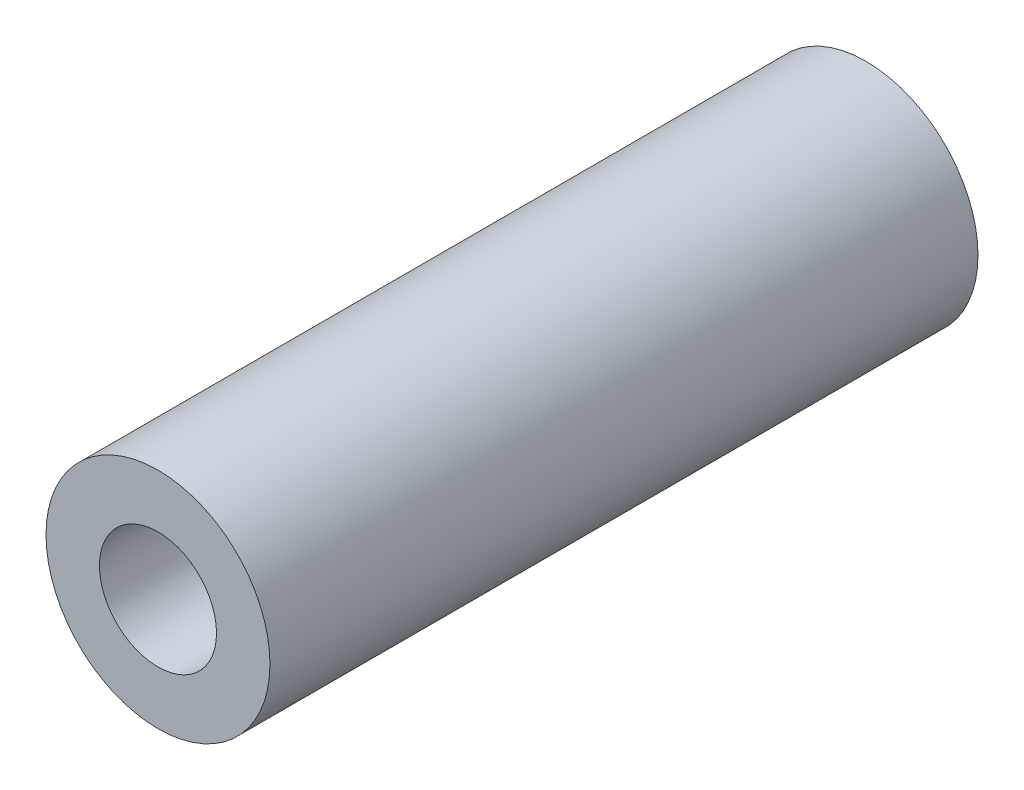
ISO-10303-21;
HEADER;
FILE_DESCRIPTION(('STEP AP214'),'2;1');
FILE_NAME('part.step','',(''),(''),'','','');
FILE_SCHEMA(('AUTOMOTIVE_DESIGN { 1 0 10303 214 1 1 1 1 }'));
ENDSEC;
DATA;
#1=APPLICATION_CONTEXT('core data for automotive mechanical design processes');
#2=APPLICATION_PROTOCOL_DEFINITION('international standard','automotive_design',2000,#1);
#3=PRODUCT_CONTEXT('',#1,'mechanical');
#4=PRODUCT('Part','Part','',(#3));
#5=PRODUCT_RELATED_PRODUCT_CATEGORY('part','',(#4));
#6=PRODUCT_DEFINITION_FORMATION('','',#4);
#7=PRODUCT_DEFINITION_CONTEXT('part definition',#1,'design');
#8=PRODUCT_DEFINITION('design','',#6,#7);
#9=PRODUCT_DEFINITION_SHAPE('','',#8);
#10=(LENGTH_UNIT() NAMED_UNIT(*) SI_UNIT(.MILLI.,.METRE.));
#11=(NAMED_UNIT(*) PLANE_ANGLE_UNIT() SI_UNIT($,.RADIAN.));
#12=(NAMED_UNIT(*) SI_UNIT($,.STERADIAN.) SOLID_ANGLE_UNIT());
#13=UNCERTAINTY_MEASURE_WITH_UNIT(LENGTH_MEASURE(1.E-05),#10,'distance_accuracy_value','');
#14=(GEOMETRIC_REPRESENTATION_CONTEXT(3) GLOBAL_UNCERTAINTY_ASSIGNED_CONTEXT((#13)) GLOBAL_UNIT_ASSIGNED_CONTEXT((#10,
#11,#12)) REPRESENTATION_CONTEXT('',''));
#15=CARTESIAN_POINT('',(0.,0.,0.));
#16=DIRECTION('',(0.,0.,1.));
#17=DIRECTION('',(1.,0.,0.));
#18=AXIS2_PLACEMENT_3D('',#15,#16,#17);
#19=CARTESIAN_POINT('',(0.,0.,15.05585));
#20=DIRECTION('',(0.,0.,1.));
#21=DIRECTION('',(1.,0.,0.));
#22=AXIS2_PLACEMENT_3D('',#19,#20,#21);
#23=PLANE('',#22);
#24=CARTESIAN_POINT('',(0.,0.,15.05585));
#25=DIRECTION('',(0.,0.,1.));
#26=DIRECTION('',(1.,0.,0.));
#27=AXIS2_PLACEMENT_3D('',#24,#25,#26);
#28=CIRCLE('',#27,4.7625);
#29=CARTESIAN_POINT('',(4.7625,0.,15.05585));
#30=VERTEX_POINT('',#29);
#31=EDGE_CURVE('E10',#30,#30,#28,.T.);
#32=ORIENTED_EDGE('',*,*,#31,.T.);
#33=EDGE_LOOP('',(#32));
#34=FACE_BOUND('',#33,.T.);
#35=CARTESIAN_POINT('',(0.,0.,15.05585));
#36=DIRECTION('',(0.,0.,1.));
#37=DIRECTION('',(1.,0.,0.));
#38=AXIS2_PLACEMENT_3D('',#35,#36,#37);
#39=CIRCLE('',#38,2.4892);
#40=CARTESIAN_POINT('',(2.4892,0.,15.05585));
#41=VERTEX_POINT('',#40);
#42=EDGE_CURVE('E56',#41,#41,#39,.T.);
#43=ORIENTED_EDGE('',*,*,#42,.F.);
#44=EDGE_LOOP('',(#43));
#45=FACE_BOUND('',#44,.T.);
#46=ADVANCED_FACE('F43',(#34,#45),#23,.T.);
#47=CARTESIAN_POINT('',(0.,0.,-15.05585));
#48=DIRECTION('',(0.,0.,1.));
#49=DIRECTION('',(1.,0.,0.));
#50=AXIS2_PLACEMENT_3D('',#47,#48,#49);
#51=PLANE('',#50);
#52=CARTESIAN_POINT('',(0.,0.,-15.05585));
#53=DIRECTION('',(0.,0.,1.));
#54=DIRECTION('',(1.,0.,0.));
#55=AXIS2_PLACEMENT_3D('',#52,#53,#54);
#56=CIRCLE('',#55,4.7625);
#57=CARTESIAN_POINT('',(4.7625,0.,-15.05585));
#58=VERTEX_POINT('',#57);
#59=EDGE_CURVE('E47',#58,#58,#56,.T.);
#60=ORIENTED_EDGE('',*,*,#59,.F.);
#61=EDGE_LOOP('',(#60));
#62=FACE_BOUND('',#61,.T.);
#63=CARTESIAN_POINT('',(0.,0.,-15.05585));
#64=DIRECTION('',(0.,0.,1.));
#65=DIRECTION('',(1.,0.,0.));
#66=AXIS2_PLACEMENT_3D('',#63,#64,#65);
#67=CIRCLE('',#66,2.4892);
#68=CARTESIAN_POINT('',(2.4892,0.,-15.05585));
#69=VERTEX_POINT('',#68);
#70=EDGE_CURVE('E58',#69,#69,#67,.T.);
#71=ORIENTED_EDGE('',*,*,#70,.T.);
#72=EDGE_LOOP('',(#71));
#73=FACE_BOUND('',#72,.T.);
#74=ADVANCED_FACE('F70',(#62,#73),#51,.F.);
#75=CARTESIAN_POINT('',(0.,0.,15.05585));
#76=DIRECTION('',(0.,0.,-1.));
#77=DIRECTION('',(-1.,0.,0.));
#78=AXIS2_PLACEMENT_3D('',#75,#76,#77);
#79=CYLINDRICAL_SURFACE('',#78,4.7625);
#80=ORIENTED_EDGE('',*,*,#31,.F.);
#81=EDGE_LOOP('',(#80));
#82=FACE_BOUND('',#81,.T.);
#83=ORIENTED_EDGE('',*,*,#59,.T.);
#84=EDGE_LOOP('',(#83));
#85=FACE_BOUND('',#84,.T.);
#86=ADVANCED_FACE('F45',(#82,#85),#79,.T.);
#87=CARTESIAN_POINT('',(0.,0.,15.05585));
#88=DIRECTION('',(0.,0.,-1.));
#89=DIRECTION('',(-1.,0.,0.));
#90=AXIS2_PLACEMENT_3D('',#87,#88,#89);
#91=CYLINDRICAL_SURFACE('',#90,2.4892);
#92=ORIENTED_EDGE('',*,*,#42,.T.);
#93=EDGE_LOOP('',(#92));
#94=FACE_BOUND('',#93,.T.);
#95=ORIENTED_EDGE('',*,*,#70,.F.);
#96=EDGE_LOOP('',(#95));
#97=FACE_BOUND('',#96,.T.);
#98=ADVANCED_FACE('F66',(#94,#97),#91,.F.);
#99=CLOSED_SHELL('',(#46,#74,#86,#98));
#100=MANIFOLD_SOLID_BREP('B2',#99);
#101=ADVANCED_BREP_SHAPE_REPRESENTATION('',(#18,#100),#14);
#102=SHAPE_DEFINITION_REPRESENTATION(#9,#101);
ENDSEC;
END-ISO-10303-21;
